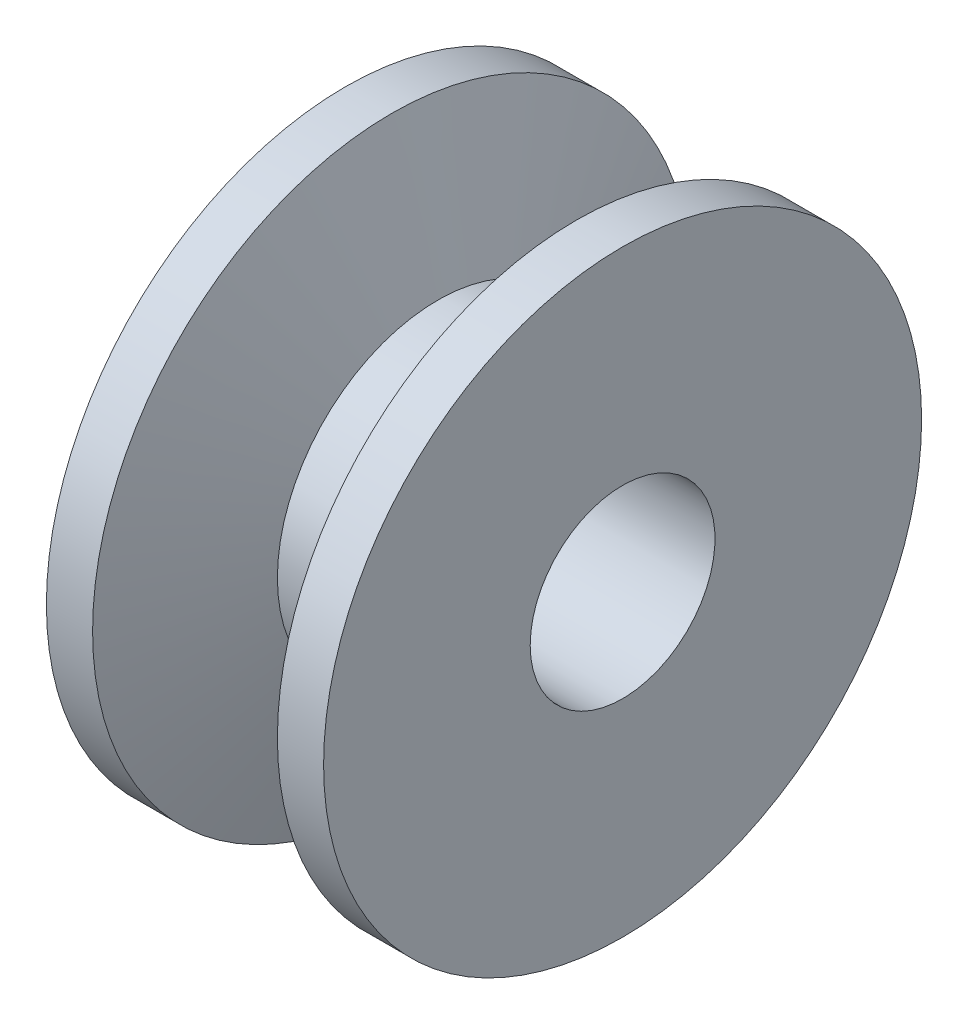
ISO-10303-21;
HEADER;
FILE_DESCRIPTION(('STEP AP214'),'2;1');
FILE_NAME('part.step','',(''),(''),'','','');
FILE_SCHEMA(('AUTOMOTIVE_DESIGN { 1 0 10303 214 1 1 1 1 }'));
ENDSEC;
DATA;
#1=APPLICATION_CONTEXT('core data for automotive mechanical design processes');
#2=APPLICATION_PROTOCOL_DEFINITION('international standard','automotive_design',2000,#1);
#3=PRODUCT_CONTEXT('',#1,'mechanical');
#4=PRODUCT('Part','Part','',(#3));
#5=PRODUCT_RELATED_PRODUCT_CATEGORY('part','',(#4));
#6=PRODUCT_DEFINITION_FORMATION('','',#4);
#7=PRODUCT_DEFINITION_CONTEXT('part definition',#1,'design');
#8=PRODUCT_DEFINITION('design','',#6,#7);
#9=PRODUCT_DEFINITION_SHAPE('','',#8);
#10=(LENGTH_UNIT() NAMED_UNIT(*) SI_UNIT(.MILLI.,.METRE.));
#11=(NAMED_UNIT(*) PLANE_ANGLE_UNIT() SI_UNIT($,.RADIAN.));
#12=(NAMED_UNIT(*) SI_UNIT($,.STERADIAN.) SOLID_ANGLE_UNIT());
#13=UNCERTAINTY_MEASURE_WITH_UNIT(LENGTH_MEASURE(1.E-05),#10,'distance_accuracy_value','');
#14=(GEOMETRIC_REPRESENTATION_CONTEXT(3) GLOBAL_UNCERTAINTY_ASSIGNED_CONTEXT((#13)) GLOBAL_UNIT_ASSIGNED_CONTEXT((#10,
#11,#12)) REPRESENTATION_CONTEXT('',''));
#15=CARTESIAN_POINT('',(0.,0.,0.));
#16=DIRECTION('',(0.,0.,1.));
#17=DIRECTION('',(1.,0.,0.));
#18=AXIS2_PLACEMENT_3D('',#15,#16,#17);
#19=CARTESIAN_POINT('',(3.,3.75045351520674,0.));
#20=DIRECTION('',(-1.,0.,0.));
#21=DIRECTION('',(0.,0.,1.));
#22=AXIS2_PLACEMENT_3D('',#19,#20,#21);
#23=PLANE('',#22);
#24=CARTESIAN_POINT('',(3.,1.75045351520674,0.));
#25=DIRECTION('',(-1.,0.,0.));
#26=DIRECTION('',(0.,0.,1.));
#27=AXIS2_PLACEMENT_3D('',#24,#25,#26);
#28=CIRCLE('',#27,6.47187884873309);
#29=CARTESIAN_POINT('',(3.,1.75045351520674,6.47187884873309));
#30=VERTEX_POINT('',#29);
#31=EDGE_CURVE('E10',#30,#30,#28,.T.);
#32=ORIENTED_EDGE('',*,*,#31,.F.);
#33=EDGE_LOOP('',(#32));
#34=FACE_BOUND('',#33,.T.);
#35=CARTESIAN_POINT('',(3.,1.75045351520674,0.));
#36=DIRECTION('',(-1.,0.,0.));
#37=DIRECTION('',(0.,0.,1.));
#38=AXIS2_PLACEMENT_3D('',#35,#36,#37);
#39=CIRCLE('',#38,2.);
#40=CARTESIAN_POINT('',(3.,1.75045351520674,2.));
#41=VERTEX_POINT('',#40);
#42=EDGE_CURVE('E58',#41,#41,#39,.T.);
#43=ORIENTED_EDGE('',*,*,#42,.T.);
#44=EDGE_LOOP('',(#43));
#45=FACE_BOUND('',#44,.T.);
#46=ADVANCED_FACE('F30',(#34,#45),#23,.F.);
#47=CARTESIAN_POINT('',(-9.7518328376538,1.75045351520674,0.));
#48=DIRECTION('',(-1.,0.,0.));
#49=DIRECTION('',(0.,0.,1.));
#50=AXIS2_PLACEMENT_3D('',#47,#48,#49);
#51=CYLINDRICAL_SURFACE('',#50,6.47187884873309);
#52=CARTESIAN_POINT('',(2.,1.75045351520674,0.));
#53=DIRECTION('',(-1.,0.,0.));
#54=DIRECTION('',(0.,0.,1.));
#55=AXIS2_PLACEMENT_3D('',#52,#53,#54);
#56=CIRCLE('',#55,6.47187884873309);
#57=CARTESIAN_POINT('',(2.,1.75045351520674,6.47187884873309));
#58=VERTEX_POINT('',#57);
#59=EDGE_CURVE('E36',#58,#58,#56,.T.);
#60=ORIENTED_EDGE('',*,*,#59,.F.);
#61=EDGE_LOOP('',(#60));
#62=FACE_BOUND('',#61,.T.);
#63=ORIENTED_EDGE('',*,*,#31,.T.);
#64=EDGE_LOOP('',(#63));
#65=FACE_BOUND('',#64,.T.);
#66=ADVANCED_FACE('F95',(#62,#65),#51,.T.);
#67=CARTESIAN_POINT('',(2.,1.75045351520674,0.));
#68=DIRECTION('',(1.,0.,0.));
#69=DIRECTION('',(0.,0.,-1.));
#70=AXIS2_PLACEMENT_3D('',#67,#68,#69);
#71=CONICAL_SURFACE('',#70,6.47187884873309,1.24904577239825);
#72=CARTESIAN_POINT('',(1.,1.75045351520674,0.));
#73=DIRECTION('',(-1.,0.,0.));
#74=DIRECTION('',(0.,0.,1.));
#75=AXIS2_PLACEMENT_3D('',#72,#73,#74);
#76=CIRCLE('',#75,3.47187884873309);
#77=CARTESIAN_POINT('',(1.,1.75045351520674,3.47187884873309));
#78=VERTEX_POINT('',#77);
#79=EDGE_CURVE('E40',#78,#78,#76,.T.);
#80=ORIENTED_EDGE('',*,*,#79,.F.);
#81=EDGE_LOOP('',(#80));
#82=FACE_BOUND('',#81,.T.);
#83=ORIENTED_EDGE('',*,*,#59,.T.);
#84=EDGE_LOOP('',(#83));
#85=FACE_BOUND('',#84,.T.);
#86=ADVANCED_FACE('F90',(#82,#85),#71,.T.);
#87=CARTESIAN_POINT('',(-9.7518328376538,1.75045351520674,0.));
#88=DIRECTION('',(-1.,0.,0.));
#89=DIRECTION('',(0.,0.,1.));
#90=AXIS2_PLACEMENT_3D('',#87,#88,#89);
#91=CYLINDRICAL_SURFACE('',#90,3.47187884873309);
#92=CARTESIAN_POINT('',(-1.,1.75045351520674,0.));
#93=DIRECTION('',(-1.,0.,0.));
#94=DIRECTION('',(0.,0.,1.));
#95=AXIS2_PLACEMENT_3D('',#92,#93,#94);
#96=CIRCLE('',#95,3.47187884873309);
#97=CARTESIAN_POINT('',(-1.,1.75045351520674,3.47187884873309));
#98=VERTEX_POINT('',#97);
#99=EDGE_CURVE('E44',#98,#98,#96,.T.);
#100=ORIENTED_EDGE('',*,*,#99,.F.);
#101=EDGE_LOOP('',(#100));
#102=FACE_BOUND('',#101,.T.);
#103=ORIENTED_EDGE('',*,*,#79,.T.);
#104=EDGE_LOOP('',(#103));
#105=FACE_BOUND('',#104,.T.);
#106=ADVANCED_FACE('F84',(#102,#105),#91,.T.);
#107=CARTESIAN_POINT('',(-1.,1.75045351520674,0.));
#108=DIRECTION('',(-1.,0.,0.));
#109=DIRECTION('',(0.,0.,1.));
#110=AXIS2_PLACEMENT_3D('',#107,#108,#109);
#111=CONICAL_SURFACE('',#110,3.47187884873309,1.24904577239825);
#112=CARTESIAN_POINT('',(-2.,1.75045351520674,0.));
#113=DIRECTION('',(-1.,0.,0.));
#114=DIRECTION('',(0.,0.,1.));
#115=AXIS2_PLACEMENT_3D('',#112,#113,#114);
#116=CIRCLE('',#115,6.47187884873309);
#117=CARTESIAN_POINT('',(-2.,1.75045351520674,6.47187884873309));
#118=VERTEX_POINT('',#117);
#119=EDGE_CURVE('E49',#118,#118,#116,.T.);
#120=ORIENTED_EDGE('',*,*,#119,.F.);
#121=EDGE_LOOP('',(#120));
#122=FACE_BOUND('',#121,.T.);
#123=ORIENTED_EDGE('',*,*,#99,.T.);
#124=EDGE_LOOP('',(#123));
#125=FACE_BOUND('',#124,.T.);
#126=ADVANCED_FACE('F78',(#122,#125),#111,.T.);
#127=CARTESIAN_POINT('',(-9.7518328376538,1.75045351520674,0.));
#128=DIRECTION('',(-1.,0.,0.));
#129=DIRECTION('',(0.,0.,1.));
#130=AXIS2_PLACEMENT_3D('',#127,#128,#129);
#131=CYLINDRICAL_SURFACE('',#130,6.47187884873309);
#132=CARTESIAN_POINT('',(-3.,1.75045351520674,0.));
#133=DIRECTION('',(-1.,0.,0.));
#134=DIRECTION('',(0.,0.,1.));
#135=AXIS2_PLACEMENT_3D('',#132,#133,#134);
#136=CIRCLE('',#135,6.47187884873309);
#137=CARTESIAN_POINT('',(-3.,1.75045351520674,6.47187884873309));
#138=VERTEX_POINT('',#137);
#139=EDGE_CURVE('E52',#138,#138,#136,.T.);
#140=ORIENTED_EDGE('',*,*,#139,.F.);
#141=EDGE_LOOP('',(#140));
#142=FACE_BOUND('',#141,.T.);
#143=ORIENTED_EDGE('',*,*,#119,.T.);
#144=EDGE_LOOP('',(#143));
#145=FACE_BOUND('',#144,.T.);
#146=ADVANCED_FACE('F72',(#142,#145),#131,.T.);
#147=CARTESIAN_POINT('',(-3.,3.75045351520674,0.));
#148=DIRECTION('',(1.,0.,0.));
#149=DIRECTION('',(0.,0.,-1.));
#150=AXIS2_PLACEMENT_3D('',#147,#148,#149);
#151=PLANE('',#150);
#152=CARTESIAN_POINT('',(-3.,1.75045351520674,0.));
#153=DIRECTION('',(-1.,0.,0.));
#154=DIRECTION('',(0.,0.,1.));
#155=AXIS2_PLACEMENT_3D('',#152,#153,#154);
#156=CIRCLE('',#155,2.);
#157=CARTESIAN_POINT('',(-3.,1.75045351520674,2.));
#158=VERTEX_POINT('',#157);
#159=EDGE_CURVE('E55',#158,#158,#156,.T.);
#160=ORIENTED_EDGE('',*,*,#159,.F.);
#161=EDGE_LOOP('',(#160));
#162=FACE_BOUND('',#161,.T.);
#163=ORIENTED_EDGE('',*,*,#139,.T.);
#164=EDGE_LOOP('',(#163));
#165=FACE_BOUND('',#164,.T.);
#166=ADVANCED_FACE('F66',(#162,#165),#151,.F.);
#167=CARTESIAN_POINT('',(-9.7518328376538,1.75045351520674,0.));
#168=DIRECTION('',(-1.,0.,0.));
#169=DIRECTION('',(0.,0.,1.));
#170=AXIS2_PLACEMENT_3D('',#167,#168,#169);
#171=CYLINDRICAL_SURFACE('',#170,2.);
#172=ORIENTED_EDGE('',*,*,#42,.F.);
#173=EDGE_LOOP('',(#172));
#174=FACE_BOUND('',#173,.T.);
#175=ORIENTED_EDGE('',*,*,#159,.T.);
#176=EDGE_LOOP('',(#175));
#177=FACE_BOUND('',#176,.T.);
#178=ADVANCED_FACE('F63',(#174,#177),#171,.F.);
#179=CLOSED_SHELL('',(#46,#66,#86,#106,#126,#146,#166,#178));
#180=MANIFOLD_SOLID_BREP('B2',#179);
#181=ADVANCED_BREP_SHAPE_REPRESENTATION('',(#18,#180),#14);
#182=SHAPE_DEFINITION_REPRESENTATION(#9,#181);
ENDSEC;
END-ISO-10303-21;
